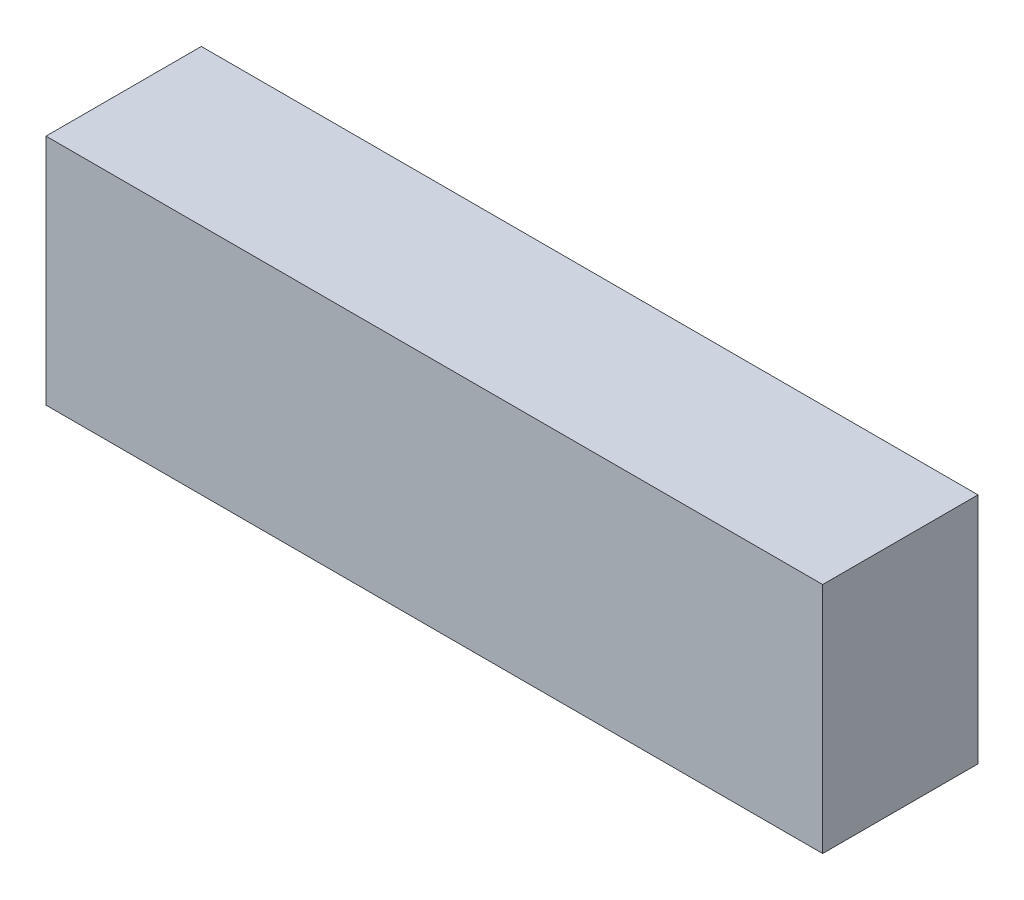
ISO-10303-21;
HEADER;
FILE_DESCRIPTION(('STEP AP214'),'2;1');
FILE_NAME('part.step','',(''),(''),'','','');
FILE_SCHEMA(('AUTOMOTIVE_DESIGN { 1 0 10303 214 1 1 1 1 }'));
ENDSEC;
DATA;
#1=APPLICATION_CONTEXT('core data for automotive mechanical design processes');
#2=APPLICATION_PROTOCOL_DEFINITION('international standard','automotive_design',2000,#1);
#3=PRODUCT_CONTEXT('',#1,'mechanical');
#4=PRODUCT('Part','Part','',(#3));
#5=PRODUCT_RELATED_PRODUCT_CATEGORY('part','',(#4));
#6=PRODUCT_DEFINITION_FORMATION('','',#4);
#7=PRODUCT_DEFINITION_CONTEXT('part definition',#1,'design');
#8=PRODUCT_DEFINITION('design','',#6,#7);
#9=PRODUCT_DEFINITION_SHAPE('','',#8);
#10=(LENGTH_UNIT() NAMED_UNIT(*) SI_UNIT(.MILLI.,.METRE.));
#11=(NAMED_UNIT(*) PLANE_ANGLE_UNIT() SI_UNIT($,.RADIAN.));
#12=(NAMED_UNIT(*) SI_UNIT($,.STERADIAN.) SOLID_ANGLE_UNIT());
#13=UNCERTAINTY_MEASURE_WITH_UNIT(LENGTH_MEASURE(1.E-05),#10,'distance_accuracy_value','');
#14=(GEOMETRIC_REPRESENTATION_CONTEXT(3) GLOBAL_UNCERTAINTY_ASSIGNED_CONTEXT((#13)) GLOBAL_UNIT_ASSIGNED_CONTEXT((#10,
#11,#12)) REPRESENTATION_CONTEXT('',''));
#15=CARTESIAN_POINT('',(0.,0.,0.));
#16=DIRECTION('',(0.,0.,1.));
#17=DIRECTION('',(1.,0.,0.));
#18=AXIS2_PLACEMENT_3D('',#15,#16,#17);
#19=CARTESIAN_POINT('',(-127.,-38.1,50.8));
#20=DIRECTION('',(1.,0.,0.));
#21=DIRECTION('',(0.,0.,-1.));
#22=AXIS2_PLACEMENT_3D('',#19,#20,#21);
#23=PLANE('',#22);
#24=DIRECTION('',(0.,-1.,0.));
#25=VECTOR('',#24,1.);
#26=CARTESIAN_POINT('',(-127.,-38.1,0.));
#27=LINE('',#26,#25);
#28=CARTESIAN_POINT('',(-127.,38.1,0.));
#29=VERTEX_POINT('',#28);
#30=CARTESIAN_POINT('',(-127.,-38.1,0.));
#31=VERTEX_POINT('',#30);
#32=EDGE_CURVE('E96',#29,#31,#27,.T.);
#33=ORIENTED_EDGE('',*,*,#32,.T.);
#34=DIRECTION('',(0.,0.,-1.));
#35=VECTOR('',#34,1.);
#36=CARTESIAN_POINT('',(-127.,-38.1,50.8));
#37=LINE('',#36,#35);
#38=CARTESIAN_POINT('',(-127.,-38.1,50.8));
#39=VERTEX_POINT('',#38);
#40=EDGE_CURVE('E11',#39,#31,#37,.T.);
#41=ORIENTED_EDGE('',*,*,#40,.F.);
#42=DIRECTION('',(0.,-1.,0.));
#43=VECTOR('',#42,1.);
#44=CARTESIAN_POINT('',(-127.,-38.1,50.8));
#45=LINE('',#44,#43);
#46=CARTESIAN_POINT('',(-127.,38.1,50.8));
#47=VERTEX_POINT('',#46);
#48=EDGE_CURVE('E84',#47,#39,#45,.T.);
#49=ORIENTED_EDGE('',*,*,#48,.F.);
#50=DIRECTION('',(0.,0.,-1.));
#51=VECTOR('',#50,1.);
#52=CARTESIAN_POINT('',(-127.,38.1,50.8));
#53=LINE('',#52,#51);
#54=EDGE_CURVE('E92',#47,#29,#53,.T.);
#55=ORIENTED_EDGE('',*,*,#54,.T.);
#56=EDGE_LOOP('',(#33,#41,#49,#55));
#57=FACE_BOUND('',#56,.T.);
#58=ADVANCED_FACE('F33',(#57),#23,.F.);
#59=CARTESIAN_POINT('',(127.,-38.1,50.8));
#60=DIRECTION('',(0.,1.,0.));
#61=DIRECTION('',(-1.,0.,0.));
#62=AXIS2_PLACEMENT_3D('',#59,#60,#61);
#63=PLANE('',#62);
#64=DIRECTION('',(1.,0.,0.));
#65=VECTOR('',#64,1.);
#66=CARTESIAN_POINT('',(127.,-38.1,0.));
#67=LINE('',#66,#65);
#68=CARTESIAN_POINT('',(127.,-38.1,0.));
#69=VERTEX_POINT('',#68);
#70=EDGE_CURVE('E88',#31,#69,#67,.T.);
#71=ORIENTED_EDGE('',*,*,#70,.T.);
#72=DIRECTION('',(0.,0.,-1.));
#73=VECTOR('',#72,1.);
#74=CARTESIAN_POINT('',(127.,-38.1,50.8));
#75=LINE('',#74,#73);
#76=CARTESIAN_POINT('',(127.,-38.1,50.8));
#77=VERTEX_POINT('',#76);
#78=EDGE_CURVE('E41',#77,#69,#75,.T.);
#79=ORIENTED_EDGE('',*,*,#78,.F.);
#80=DIRECTION('',(1.,0.,0.));
#81=VECTOR('',#80,1.);
#82=CARTESIAN_POINT('',(127.,-38.1,50.8));
#83=LINE('',#82,#81);
#84=EDGE_CURVE('E79',#39,#77,#83,.T.);
#85=ORIENTED_EDGE('',*,*,#84,.F.);
#86=ORIENTED_EDGE('',*,*,#40,.T.);
#87=EDGE_LOOP('',(#71,#79,#85,#86));
#88=FACE_BOUND('',#87,.T.);
#89=ADVANCED_FACE('F87',(#88),#63,.F.);
#90=CARTESIAN_POINT('',(127.,-38.1,50.8));
#91=DIRECTION('',(-1.,0.,0.));
#92=DIRECTION('',(0.,0.,1.));
#93=AXIS2_PLACEMENT_3D('',#90,#91,#92);
#94=PLANE('',#93);
#95=DIRECTION('',(0.,1.,0.));
#96=VECTOR('',#95,1.);
#97=CARTESIAN_POINT('',(127.,-38.1,0.));
#98=LINE('',#97,#96);
#99=CARTESIAN_POINT('',(127.,38.1,0.));
#100=VERTEX_POINT('',#99);
#101=EDGE_CURVE('E66',#69,#100,#98,.T.);
#102=ORIENTED_EDGE('',*,*,#101,.T.);
#103=DIRECTION('',(0.,0.,-1.));
#104=VECTOR('',#103,1.);
#105=CARTESIAN_POINT('',(127.,38.1,50.8));
#106=LINE('',#105,#104);
#107=CARTESIAN_POINT('',(127.,38.1,50.8));
#108=VERTEX_POINT('',#107);
#109=EDGE_CURVE('E89',#108,#100,#106,.T.);
#110=ORIENTED_EDGE('',*,*,#109,.F.);
#111=DIRECTION('',(0.,1.,0.));
#112=VECTOR('',#111,1.);
#113=CARTESIAN_POINT('',(127.,-38.1,50.8));
#114=LINE('',#113,#112);
#115=EDGE_CURVE('E82',#77,#108,#114,.T.);
#116=ORIENTED_EDGE('',*,*,#115,.F.);
#117=ORIENTED_EDGE('',*,*,#78,.T.);
#118=EDGE_LOOP('',(#102,#110,#116,#117));
#119=FACE_BOUND('',#118,.T.);
#120=ADVANCED_FACE('F90',(#119),#94,.F.);
#121=CARTESIAN_POINT('',(127.,38.1,50.8));
#122=DIRECTION('',(0.,-1.,0.));
#123=DIRECTION('',(1.,0.,0.));
#124=AXIS2_PLACEMENT_3D('',#121,#122,#123);
#125=PLANE('',#124);
#126=DIRECTION('',(-1.,0.,0.));
#127=VECTOR('',#126,1.);
#128=CARTESIAN_POINT('',(127.,38.1,0.));
#129=LINE('',#128,#127);
#130=EDGE_CURVE('E72',#100,#29,#129,.T.);
#131=ORIENTED_EDGE('',*,*,#130,.T.);
#132=ORIENTED_EDGE('',*,*,#54,.F.);
#133=DIRECTION('',(-1.,0.,0.));
#134=VECTOR('',#133,1.);
#135=CARTESIAN_POINT('',(127.,38.1,50.8));
#136=LINE('',#135,#134);
#137=EDGE_CURVE('E49',#108,#47,#136,.T.);
#138=ORIENTED_EDGE('',*,*,#137,.F.);
#139=ORIENTED_EDGE('',*,*,#109,.T.);
#140=EDGE_LOOP('',(#131,#132,#138,#139));
#141=FACE_BOUND('',#140,.T.);
#142=ADVANCED_FACE('F103',(#141),#125,.F.);
#143=CARTESIAN_POINT('',(0.,0.,50.8));
#144=DIRECTION('',(0.,0.,1.));
#145=DIRECTION('',(1.,0.,0.));
#146=AXIS2_PLACEMENT_3D('',#143,#144,#145);
#147=PLANE('',#146);
#148=ORIENTED_EDGE('',*,*,#48,.T.);
#149=ORIENTED_EDGE('',*,*,#84,.T.);
#150=ORIENTED_EDGE('',*,*,#115,.T.);
#151=ORIENTED_EDGE('',*,*,#137,.T.);
#152=EDGE_LOOP('',(#148,#149,#150,#151));
#153=FACE_BOUND('',#152,.T.);
#154=ADVANCED_FACE('F80',(#153),#147,.T.);
#155=CARTESIAN_POINT('',(0.,0.,0.));
#156=DIRECTION('',(0.,0.,1.));
#157=DIRECTION('',(1.,0.,0.));
#158=AXIS2_PLACEMENT_3D('',#155,#156,#157);
#159=PLANE('',#158);
#160=ORIENTED_EDGE('',*,*,#32,.F.);
#161=ORIENTED_EDGE('',*,*,#130,.F.);
#162=ORIENTED_EDGE('',*,*,#101,.F.);
#163=ORIENTED_EDGE('',*,*,#70,.F.);
#164=EDGE_LOOP('',(#160,#161,#162,#163));
#165=FACE_BOUND('',#164,.T.);
#166=ADVANCED_FACE('F106',(#165),#159,.F.);
#167=CLOSED_SHELL('',(#58,#89,#120,#142,#154,#166));
#168=MANIFOLD_SOLID_BREP('B2',#167);
#169=ADVANCED_BREP_SHAPE_REPRESENTATION('',(#18,#168),#14);
#170=SHAPE_DEFINITION_REPRESENTATION(#9,#169);
ENDSEC;
END-ISO-10303-21;
